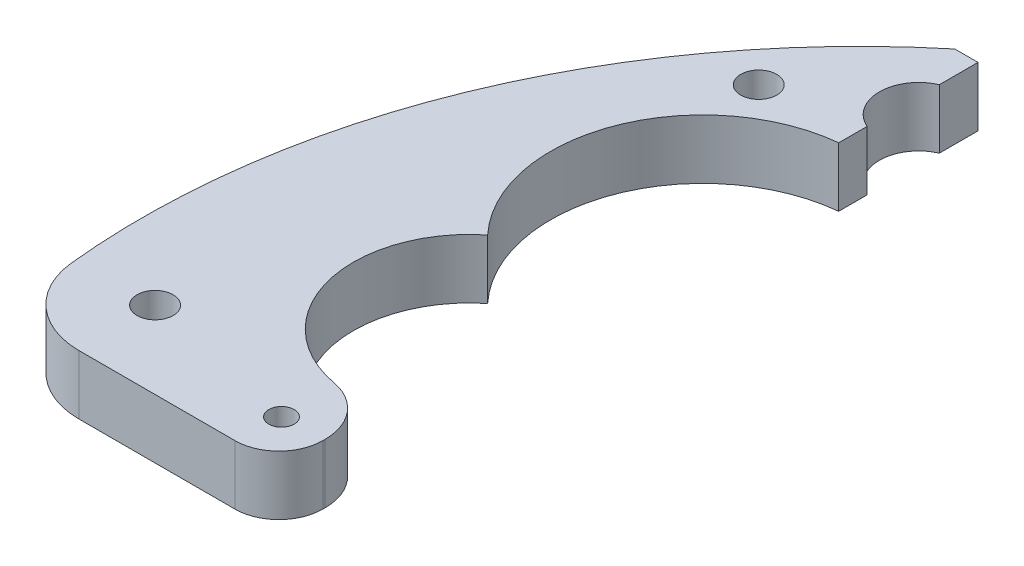
ISO-10303-21;
HEADER;
FILE_DESCRIPTION(('STEP AP214'),'2;1');
FILE_NAME('part.step','',(''),(''),'','','');
FILE_SCHEMA(('AUTOMOTIVE_DESIGN { 1 0 10303 214 1 1 1 1 }'));
ENDSEC;
DATA;
#1=APPLICATION_CONTEXT('core data for automotive mechanical design processes');
#2=APPLICATION_PROTOCOL_DEFINITION('international standard','automotive_design',2000,#1);
#3=PRODUCT_CONTEXT('',#1,'mechanical');
#4=PRODUCT('Part','Part','',(#3));
#5=PRODUCT_RELATED_PRODUCT_CATEGORY('part','',(#4));
#6=PRODUCT_DEFINITION_FORMATION('','',#4);
#7=PRODUCT_DEFINITION_CONTEXT('part definition',#1,'design');
#8=PRODUCT_DEFINITION('design','',#6,#7);
#9=PRODUCT_DEFINITION_SHAPE('','',#8);
#10=(LENGTH_UNIT() NAMED_UNIT(*) SI_UNIT(.MILLI.,.METRE.));
#11=(NAMED_UNIT(*) PLANE_ANGLE_UNIT() SI_UNIT($,.RADIAN.));
#12=(NAMED_UNIT(*) SI_UNIT($,.STERADIAN.) SOLID_ANGLE_UNIT());
#13=UNCERTAINTY_MEASURE_WITH_UNIT(LENGTH_MEASURE(1.E-05),#10,'distance_accuracy_value','');
#14=(GEOMETRIC_REPRESENTATION_CONTEXT(3) GLOBAL_UNCERTAINTY_ASSIGNED_CONTEXT((#13)) GLOBAL_UNIT_ASSIGNED_CONTEXT((#10,
#11,#12)) REPRESENTATION_CONTEXT('',''));
#15=CARTESIAN_POINT('',(0.,0.,0.));
#16=DIRECTION('',(0.,0.,1.));
#17=DIRECTION('',(1.,0.,0.));
#18=AXIS2_PLACEMENT_3D('',#15,#16,#17);
#19=CARTESIAN_POINT('',(32.6658026038348,5.842,-69.4049991597628));
#20=DIRECTION('',(-1.,0.,0.));
#21=DIRECTION('',(0.,0.,1.));
#22=AXIS2_PLACEMENT_3D('',#19,#20,#21);
#23=PLANE('',#22);
#24=DIRECTION('',(0.,0.,-1.));
#25=VECTOR('',#24,1.);
#26=CARTESIAN_POINT('',(32.6658026038348,0.,-69.4049991597628));
#27=LINE('',#26,#25);
#28=CARTESIAN_POINT('',(32.6658026038348,0.,-4.88899915976282));
#29=VERTEX_POINT('',#28);
#30=CARTESIAN_POINT('',(32.6658026038348,0.,-5.12803301314726));
#31=VERTEX_POINT('',#30);
#32=EDGE_CURVE('E173',#29,#31,#27,.T.);
#33=ORIENTED_EDGE('',*,*,#32,.T.);
#34=DIRECTION('',(0.,1.,0.));
#35=VECTOR('',#34,1.);
#36=CARTESIAN_POINT('',(32.6658026038348,5.842,-5.12803301314726));
#37=LINE('',#36,#35);
#38=CARTESIAN_POINT('',(32.6658026038348,5.842,-5.12803301314726));
#39=VERTEX_POINT('',#38);
#40=EDGE_CURVE('E202',#31,#39,#37,.T.);
#41=ORIENTED_EDGE('',*,*,#40,.T.);
#42=DIRECTION('',(0.,0.,-1.));
#43=VECTOR('',#42,1.);
#44=CARTESIAN_POINT('',(32.6658026038348,5.842,-69.4049991597628));
#45=LINE('',#44,#43);
#46=CARTESIAN_POINT('',(32.6658026038348,5.842,-4.88899915976282));
#47=VERTEX_POINT('',#46);
#48=EDGE_CURVE('E161',#47,#39,#45,.T.);
#49=ORIENTED_EDGE('',*,*,#48,.F.);
#50=DIRECTION('',(0.,-1.,0.));
#51=VECTOR('',#50,1.);
#52=CARTESIAN_POINT('',(32.6658026038348,5.842,-4.88899915976282));
#53=LINE('',#52,#51);
#54=EDGE_CURVE('E193',#47,#29,#53,.T.);
#55=ORIENTED_EDGE('',*,*,#54,.T.);
#56=EDGE_LOOP('',(#33,#41,#49,#55));
#57=FACE_BOUND('',#56,.T.);
#58=ADVANCED_FACE('F33',(#57),#23,.F.);
#59=CARTESIAN_POINT('',(32.6658026038348,5.842,-55.6889991597628));
#60=VERTEX_POINT('',#59);
#61=CARTESIAN_POINT('',(32.6658026038348,5.842,-58.4829991597628));
#62=VERTEX_POINT('',#61);
#63=EDGE_CURVE('E164',#60,#62,#45,.T.);
#64=ORIENTED_EDGE('',*,*,#63,.F.);
#65=DIRECTION('',(0.,1.,0.));
#66=VECTOR('',#65,1.);
#67=CARTESIAN_POINT('',(32.6658026038348,0.,-55.6889991597628));
#68=LINE('',#67,#66);
#69=CARTESIAN_POINT('',(32.6658026038348,0.,-55.6889991597628));
#70=VERTEX_POINT('',#69);
#71=EDGE_CURVE('E137',#70,#60,#68,.T.);
#72=ORIENTED_EDGE('',*,*,#71,.F.);
#73=CARTESIAN_POINT('',(32.6658026038348,0.,-58.4829991597628));
#74=VERTEX_POINT('',#73);
#75=EDGE_CURVE('E177',#70,#74,#27,.T.);
#76=ORIENTED_EDGE('',*,*,#75,.T.);
#77=DIRECTION('',(0.,1.,0.));
#78=VECTOR('',#77,1.);
#79=CARTESIAN_POINT('',(32.6658026038348,0.,-58.4829991597628));
#80=LINE('',#79,#78);
#81=EDGE_CURVE('E148',#74,#62,#80,.T.);
#82=ORIENTED_EDGE('',*,*,#81,.T.);
#83=EDGE_LOOP('',(#64,#72,#76,#82));
#84=FACE_BOUND('',#83,.T.);
#85=ADVANCED_FACE('F231',(#84),#23,.F.);
#86=CARTESIAN_POINT('',(32.6658026038348,5.842,-0.570999159762817));
#87=DIRECTION('',(0.,0.,-1.));
#88=DIRECTION('',(-1.,0.,0.));
#89=AXIS2_PLACEMENT_3D('',#86,#87,#88);
#90=PLANE('',#89);
#91=DIRECTION('',(1.,0.,0.));
#92=VECTOR('',#91,1.);
#93=CARTESIAN_POINT('',(32.6658026038348,0.,-0.570999159762817));
#94=LINE('',#93,#92);
#95=CARTESIAN_POINT('',(12.9787536595602,0.,-0.570999159762814));
#96=VERTEX_POINT('',#95);
#97=CARTESIAN_POINT('',(28.3478026038348,0.,-0.570999159762816));
#98=VERTEX_POINT('',#97);
#99=EDGE_CURVE('E153',#96,#98,#94,.T.);
#100=ORIENTED_EDGE('',*,*,#99,.T.);
#101=DIRECTION('',(0.,-1.,0.));
#102=VECTOR('',#101,1.);
#103=CARTESIAN_POINT('',(28.3478026038348,5.842,-0.570999159762816));
#104=LINE('',#103,#102);
#105=CARTESIAN_POINT('',(28.3478026038348,5.842,-0.570999159762816));
#106=VERTEX_POINT('',#105);
#107=EDGE_CURVE('E198',#98,#106,#104,.F.);
#108=ORIENTED_EDGE('',*,*,#107,.T.);
#109=DIRECTION('',(1.,0.,0.));
#110=VECTOR('',#109,1.);
#111=CARTESIAN_POINT('',(32.6658026038348,5.842,-0.570999159762817));
#112=LINE('',#111,#110);
#113=CARTESIAN_POINT('',(12.9787536595602,5.842,-0.570999159762814));
#114=VERTEX_POINT('',#113);
#115=EDGE_CURVE('E156',#114,#106,#112,.T.);
#116=ORIENTED_EDGE('',*,*,#115,.F.);
#117=DIRECTION('',(0.,-1.,0.));
#118=VECTOR('',#117,1.);
#119=CARTESIAN_POINT('',(12.9787536595602,5.842,-0.570999159762814));
#120=LINE('',#119,#118);
#121=EDGE_CURVE('E126',#114,#96,#120,.T.);
#122=ORIENTED_EDGE('',*,*,#121,.T.);
#123=EDGE_LOOP('',(#100,#108,#116,#122));
#124=FACE_BOUND('',#123,.T.);
#125=ADVANCED_FACE('F237',(#124),#90,.F.);
#126=CARTESIAN_POINT('',(32.6658026038348,5.842,-65.5949991597628));
#127=VERTEX_POINT('',#126);
#128=CARTESIAN_POINT('',(32.6658026038348,5.842,-69.4049991597628));
#129=VERTEX_POINT('',#128);
#130=EDGE_CURVE('E159',#127,#129,#45,.T.);
#131=ORIENTED_EDGE('',*,*,#130,.F.);
#132=DIRECTION('',(0.,1.,0.));
#133=VECTOR('',#132,1.);
#134=CARTESIAN_POINT('',(32.6658026038348,0.,-65.5949991597628));
#135=LINE('',#134,#133);
#136=CARTESIAN_POINT('',(32.6658026038348,0.,-65.5949991597628));
#137=VERTEX_POINT('',#136);
#138=EDGE_CURVE('E151',#137,#127,#135,.T.);
#139=ORIENTED_EDGE('',*,*,#138,.F.);
#140=CARTESIAN_POINT('',(32.6658026038348,0.,-69.4049991597628));
#141=VERTEX_POINT('',#140);
#142=EDGE_CURVE('E172',#137,#141,#27,.T.);
#143=ORIENTED_EDGE('',*,*,#142,.T.);
#144=DIRECTION('',(0.,-1.,0.));
#145=VECTOR('',#144,1.);
#146=CARTESIAN_POINT('',(32.6658026038348,5.842,-69.4049991597628));
#147=LINE('',#146,#145);
#148=EDGE_CURVE('E127',#129,#141,#147,.T.);
#149=ORIENTED_EDGE('',*,*,#148,.F.);
#150=EDGE_LOOP('',(#131,#139,#143,#149));
#151=FACE_BOUND('',#150,.T.);
#152=ADVANCED_FACE('F233',(#151),#23,.F.);
#153=CARTESIAN_POINT('',(30.3798026038348,5.842,-69.4049991597628));
#154=DIRECTION('',(0.,0.,1.));
#155=DIRECTION('',(1.,0.,0.));
#156=AXIS2_PLACEMENT_3D('',#153,#154,#155);
#157=PLANE('',#156);
#158=DIRECTION('',(-1.,0.,0.));
#159=VECTOR('',#158,1.);
#160=CARTESIAN_POINT('',(30.3798026038348,0.,-69.4049991597628));
#161=LINE('',#160,#159);
#162=CARTESIAN_POINT('',(30.3798026038348,0.,-69.4049991597628));
#163=VERTEX_POINT('',#162);
#164=EDGE_CURVE('E176',#141,#163,#161,.T.);
#165=ORIENTED_EDGE('',*,*,#164,.T.);
#166=DIRECTION('',(0.,-1.,0.));
#167=VECTOR('',#166,1.);
#168=CARTESIAN_POINT('',(30.3798026038348,5.842,-69.4049991597628));
#169=LINE('',#168,#167);
#170=CARTESIAN_POINT('',(30.3798026038348,5.842,-69.4049991597628));
#171=VERTEX_POINT('',#170);
#172=EDGE_CURVE('E169',#171,#163,#169,.T.);
#173=ORIENTED_EDGE('',*,*,#172,.F.);
#174=DIRECTION('',(-1.,0.,0.));
#175=VECTOR('',#174,1.);
#176=CARTESIAN_POINT('',(30.3798026038348,5.842,-69.4049991597628));
#177=LINE('',#176,#175);
#178=EDGE_CURVE('E163',#129,#171,#177,.T.);
#179=ORIENTED_EDGE('',*,*,#178,.F.);
#180=ORIENTED_EDGE('',*,*,#148,.T.);
#181=EDGE_LOOP('',(#165,#173,#179,#180));
#182=FACE_BOUND('',#181,.T.);
#183=ADVANCED_FACE('F242',(#182),#157,.F.);
#184=CARTESIAN_POINT('',(75.3749079719163,5.842,-14.9853791967822));
#185=DIRECTION('',(0.,-1.,0.));
#186=DIRECTION('',(0.,0.,-1.));
#187=AXIS2_PLACEMENT_3D('',#184,#185,#186);
#188=CYLINDRICAL_SURFACE('',#187,70.612);
#189=CARTESIAN_POINT('',(75.3749079719163,0.,-14.9853791967822));
#190=DIRECTION('',(0.,1.,0.));
#191=DIRECTION('',(0.,0.,-1.));
#192=AXIS2_PLACEMENT_3D('',#189,#190,#191);
#193=CIRCLE('',#192,70.612);
#194=CARTESIAN_POINT('',(5.14765736934546,0.,-7.62414174620977));
#195=VERTEX_POINT('',#194);
#196=EDGE_CURVE('E160',#163,#195,#193,.T.);
#197=ORIENTED_EDGE('',*,*,#196,.T.);
#198=DIRECTION('',(0.,-1.,0.));
#199=VECTOR('',#198,1.);
#200=CARTESIAN_POINT('',(5.14765736934546,5.842,-7.62414174620977));
#201=LINE('',#200,#199);
#202=CARTESIAN_POINT('',(5.14765736934546,5.842,-7.62414174620977));
#203=VERTEX_POINT('',#202);
#204=EDGE_CURVE('E189',#195,#203,#201,.F.);
#205=ORIENTED_EDGE('',*,*,#204,.T.);
#206=CARTESIAN_POINT('',(75.3749079719163,5.842,-14.9853791967822));
#207=DIRECTION('',(0.,1.,0.));
#208=DIRECTION('',(0.,0.,-1.));
#209=AXIS2_PLACEMENT_3D('',#206,#207,#208);
#210=CIRCLE('',#209,70.612);
#211=EDGE_CURVE('E166',#171,#203,#210,.T.);
#212=ORIENTED_EDGE('',*,*,#211,.F.);
#213=ORIENTED_EDGE('',*,*,#172,.T.);
#214=EDGE_LOOP('',(#197,#205,#212,#213));
#215=FACE_BOUND('',#214,.T.);
#216=ADVANCED_FACE('F248',(#215),#188,.T.);
#217=CARTESIAN_POINT('',(75.3749079719163,5.842,-14.9853791967822));
#218=DIRECTION('',(0.,-1.,0.));
#219=DIRECTION('',(0.,0.,-1.));
#220=AXIS2_PLACEMENT_3D('',#217,#218,#219);
#221=PLANE('',#220);
#222=CARTESIAN_POINT('',(12.8538026038348,5.842,-8.19099915976281));
#223=DIRECTION('',(0.,1.,0.));
#224=DIRECTION('',(0.,0.,1.));
#225=AXIS2_PLACEMENT_3D('',#222,#223,#224);
#226=CIRCLE('',#225,1.778);
#227=CARTESIAN_POINT('',(12.8538026038348,5.842,-6.41299915976281));
#228=VERTEX_POINT('',#227);
#229=EDGE_CURVE('E378',#228,#228,#226,.T.);
#230=ORIENTED_EDGE('',*,*,#229,.F.);
#231=EDGE_LOOP('',(#230));
#232=FACE_BOUND('',#231,.T.);
#233=CARTESIAN_POINT('',(28.6018026038348,5.842,-4.88899915976282));
#234=DIRECTION('',(0.,1.,0.));
#235=DIRECTION('',(0.,0.,1.));
#236=AXIS2_PLACEMENT_3D('',#233,#234,#235);
#237=CIRCLE('',#236,1.25);
#238=CARTESIAN_POINT('',(28.6018026038348,5.842,-3.63899915976281));
#239=VERTEX_POINT('',#238);
#240=EDGE_CURVE('E380',#239,#239,#237,.T.);
#241=ORIENTED_EDGE('',*,*,#240,.F.);
#242=EDGE_LOOP('',(#241));
#243=FACE_BOUND('',#242,.T.);
#244=CARTESIAN_POINT('',(23.7758026038348,5.842,-56.7049991597628));
#245=DIRECTION('',(0.,1.,0.));
#246=DIRECTION('',(0.,0.,1.));
#247=AXIS2_PLACEMENT_3D('',#244,#245,#246);
#248=CIRCLE('',#247,1.77480569885582);
#249=CARTESIAN_POINT('',(23.7758026038348,5.842,-54.930193460907));
#250=VERTEX_POINT('',#249);
#251=EDGE_CURVE('E386',#250,#250,#248,.T.);
#252=ORIENTED_EDGE('',*,*,#251,.F.);
#253=EDGE_LOOP('',(#252));
#254=FACE_BOUND('',#253,.T.);
#255=ORIENTED_EDGE('',*,*,#48,.T.);
#256=CARTESIAN_POINT('',(27.3318026038348,5.842,-5.12803301314727));
#257=DIRECTION('',(0.,-1.,0.));
#258=DIRECTION('',(0.,0.,-1.));
#259=AXIS2_PLACEMENT_3D('',#256,#257,#258);
#260=CIRCLE('',#259,5.334);
#261=CARTESIAN_POINT('',(28.3016207856529,5.842,-10.3731267867813));
#262=VERTEX_POINT('',#261);
#263=EDGE_CURVE('E55',#39,#262,#260,.F.);
#264=ORIENTED_EDGE('',*,*,#263,.T.);
#265=CARTESIAN_POINT('',(30.3798026038348,5.842,-21.6126134445686));
#266=DIRECTION('',(0.,1.,0.));
#267=DIRECTION('',(0.,0.,1.));
#268=AXIS2_PLACEMENT_3D('',#265,#266,#267);
#269=CIRCLE('',#268,11.43);
#270=CARTESIAN_POINT('',(23.2458618290697,5.842,-30.5429991597628));
#271=VERTEX_POINT('',#270);
#272=EDGE_CURVE('E121',#271,#262,#269,.T.);
#273=ORIENTED_EDGE('',*,*,#272,.F.);
#274=CARTESIAN_POINT('',(34.1898026038348,5.842,-40.7806920794804));
#275=DIRECTION('',(0.,1.,0.));
#276=DIRECTION('',(0.,0.,1.));
#277=AXIS2_PLACEMENT_3D('',#274,#275,#276);
#278=CIRCLE('',#277,14.986);
#279=EDGE_CURVE('E131',#60,#271,#278,.T.);
#280=ORIENTED_EDGE('',*,*,#279,.F.);
#281=ORIENTED_EDGE('',*,*,#63,.T.);
#282=CARTESIAN_POINT('',(34.1898026038348,5.842,-62.0389991597628));
#283=DIRECTION('',(0.,1.,0.));
#284=DIRECTION('',(0.,0.,-1.));
#285=AXIS2_PLACEMENT_3D('',#282,#283,#284);
#286=CIRCLE('',#285,3.86881273777886);
#287=EDGE_CURVE('E144',#127,#62,#286,.T.);
#288=ORIENTED_EDGE('',*,*,#287,.F.);
#289=ORIENTED_EDGE('',*,*,#130,.T.);
#290=ORIENTED_EDGE('',*,*,#178,.T.);
#291=ORIENTED_EDGE('',*,*,#211,.T.);
#292=CARTESIAN_POINT('',(12.9787536595602,5.842,-8.44499915976281));
#293=DIRECTION('',(0.,-1.,0.));
#294=DIRECTION('',(0.,0.,-1.));
#295=AXIS2_PLACEMENT_3D('',#292,#293,#294);
#296=CIRCLE('',#295,7.874);
#297=EDGE_CURVE('E191',#203,#114,#296,.F.);
#298=ORIENTED_EDGE('',*,*,#297,.T.);
#299=ORIENTED_EDGE('',*,*,#115,.T.);
#300=CARTESIAN_POINT('',(28.3478026038348,5.842,-4.88899915976282));
#301=DIRECTION('',(0.,-1.,0.));
#302=DIRECTION('',(0.,0.,-1.));
#303=AXIS2_PLACEMENT_3D('',#300,#301,#302);
#304=CIRCLE('',#303,4.318);
#305=EDGE_CURVE('E200',#106,#47,#304,.F.);
#306=ORIENTED_EDGE('',*,*,#305,.T.);
#307=EDGE_LOOP('',(#255,#264,#273,#280,#281,#288,#289,#290,#291,#298,#299,#306));
#308=FACE_BOUND('',#307,.T.);
#309=ADVANCED_FACE('F130',(#232,#243,#254,#308),#221,.F.);
#310=CARTESIAN_POINT('',(75.3749079719163,0.,-14.9853791967822));
#311=DIRECTION('',(0.,-1.,0.));
#312=DIRECTION('',(0.,0.,-1.));
#313=AXIS2_PLACEMENT_3D('',#310,#311,#312);
#314=PLANE('',#313);
#315=CARTESIAN_POINT('',(12.8538026038348,0.,-8.19099915976281));
#316=DIRECTION('',(0.,1.,0.));
#317=DIRECTION('',(0.,0.,1.));
#318=AXIS2_PLACEMENT_3D('',#315,#316,#317);
#319=CIRCLE('',#318,1.778);
#320=CARTESIAN_POINT('',(12.8538026038348,0.,-6.41299915976281));
#321=VERTEX_POINT('',#320);
#322=EDGE_CURVE('E375',#321,#321,#319,.T.);
#323=ORIENTED_EDGE('',*,*,#322,.T.);
#324=EDGE_LOOP('',(#323));
#325=FACE_BOUND('',#324,.T.);
#326=CARTESIAN_POINT('',(28.6018026038348,0.,-4.88899915976282));
#327=DIRECTION('',(0.,1.,0.));
#328=DIRECTION('',(0.,0.,1.));
#329=AXIS2_PLACEMENT_3D('',#326,#327,#328);
#330=CIRCLE('',#329,1.25);
#331=CARTESIAN_POINT('',(28.6018026038348,0.,-3.63899915976281));
#332=VERTEX_POINT('',#331);
#333=EDGE_CURVE('E383',#332,#332,#330,.T.);
#334=ORIENTED_EDGE('',*,*,#333,.T.);
#335=EDGE_LOOP('',(#334));
#336=FACE_BOUND('',#335,.T.);
#337=CARTESIAN_POINT('',(23.7758026038348,0.,-56.7049991597628));
#338=DIRECTION('',(0.,1.,0.));
#339=DIRECTION('',(0.,0.,1.));
#340=AXIS2_PLACEMENT_3D('',#337,#338,#339);
#341=CIRCLE('',#340,1.77480569885582);
#342=CARTESIAN_POINT('',(23.7758026038348,0.,-54.930193460907));
#343=VERTEX_POINT('',#342);
#344=EDGE_CURVE('E133',#343,#343,#341,.T.);
#345=ORIENTED_EDGE('',*,*,#344,.T.);
#346=EDGE_LOOP('',(#345));
#347=FACE_BOUND('',#346,.T.);
#348=CARTESIAN_POINT('',(30.3798026038348,0.,-21.6126134445686));
#349=DIRECTION('',(0.,1.,0.));
#350=DIRECTION('',(0.,0.,1.));
#351=AXIS2_PLACEMENT_3D('',#348,#349,#350);
#352=CIRCLE('',#351,11.43);
#353=CARTESIAN_POINT('',(23.2458618290697,0.,-30.5429991597628));
#354=VERTEX_POINT('',#353);
#355=CARTESIAN_POINT('',(28.3016207856529,0.,-10.3731267867813));
#356=VERTEX_POINT('',#355);
#357=EDGE_CURVE('E122',#354,#356,#352,.T.);
#358=ORIENTED_EDGE('',*,*,#357,.T.);
#359=CARTESIAN_POINT('',(27.3318026038348,0.,-5.12803301314727));
#360=DIRECTION('',(0.,-1.,0.));
#361=DIRECTION('',(0.,0.,-1.));
#362=AXIS2_PLACEMENT_3D('',#359,#360,#361);
#363=CIRCLE('',#362,5.334);
#364=EDGE_CURVE('E11',#356,#31,#363,.T.);
#365=ORIENTED_EDGE('',*,*,#364,.T.);
#366=ORIENTED_EDGE('',*,*,#32,.F.);
#367=CARTESIAN_POINT('',(28.3478026038348,0.,-4.88899915976282));
#368=DIRECTION('',(0.,-1.,0.));
#369=DIRECTION('',(0.,0.,-1.));
#370=AXIS2_PLACEMENT_3D('',#367,#368,#369);
#371=CIRCLE('',#370,4.318);
#372=EDGE_CURVE('E196',#29,#98,#371,.T.);
#373=ORIENTED_EDGE('',*,*,#372,.T.);
#374=ORIENTED_EDGE('',*,*,#99,.F.);
#375=CARTESIAN_POINT('',(12.9787536595602,0.,-8.44499915976281));
#376=DIRECTION('',(0.,-1.,0.));
#377=DIRECTION('',(0.,0.,-1.));
#378=AXIS2_PLACEMENT_3D('',#375,#376,#377);
#379=CIRCLE('',#378,7.874);
#380=EDGE_CURVE('E187',#96,#195,#379,.T.);
#381=ORIENTED_EDGE('',*,*,#380,.T.);
#382=ORIENTED_EDGE('',*,*,#196,.F.);
#383=ORIENTED_EDGE('',*,*,#164,.F.);
#384=ORIENTED_EDGE('',*,*,#142,.F.);
#385=CARTESIAN_POINT('',(34.1898026038348,0.,-62.0389991597628));
#386=DIRECTION('',(0.,1.,0.));
#387=DIRECTION('',(0.,0.,-1.));
#388=AXIS2_PLACEMENT_3D('',#385,#386,#387);
#389=CIRCLE('',#388,3.86881273777886);
#390=EDGE_CURVE('E145',#137,#74,#389,.T.);
#391=ORIENTED_EDGE('',*,*,#390,.T.);
#392=ORIENTED_EDGE('',*,*,#75,.F.);
#393=CARTESIAN_POINT('',(34.1898026038348,0.,-40.7806920794804));
#394=DIRECTION('',(0.,1.,0.));
#395=DIRECTION('',(0.,0.,1.));
#396=AXIS2_PLACEMENT_3D('',#393,#394,#395);
#397=CIRCLE('',#396,14.986);
#398=EDGE_CURVE('E138',#70,#354,#397,.T.);
#399=ORIENTED_EDGE('',*,*,#398,.T.);
#400=EDGE_LOOP('',(#358,#365,#366,#373,#374,#381,#382,#383,#384,#391,#392,#399));
#401=FACE_BOUND('',#400,.T.);
#402=ADVANCED_FACE('F218',(#325,#336,#347,#401),#314,.T.);
#403=CARTESIAN_POINT('',(34.1898026038348,0.,-62.0389991597628));
#404=DIRECTION('',(0.,1.,0.));
#405=DIRECTION('',(0.,0.,1.));
#406=AXIS2_PLACEMENT_3D('',#403,#404,#405);
#407=CYLINDRICAL_SURFACE('',#406,3.86881273777886);
#408=ORIENTED_EDGE('',*,*,#287,.T.);
#409=ORIENTED_EDGE('',*,*,#81,.F.);
#410=ORIENTED_EDGE('',*,*,#390,.F.);
#411=ORIENTED_EDGE('',*,*,#138,.T.);
#412=EDGE_LOOP('',(#408,#409,#410,#411));
#413=FACE_BOUND('',#412,.T.);
#414=ADVANCED_FACE('F259',(#413),#407,.F.);
#415=CARTESIAN_POINT('',(34.1898026038348,0.,-40.7806920794804));
#416=DIRECTION('',(0.,1.,0.));
#417=DIRECTION('',(0.,0.,1.));
#418=AXIS2_PLACEMENT_3D('',#415,#416,#417);
#419=CYLINDRICAL_SURFACE('',#418,14.986);
#420=ORIENTED_EDGE('',*,*,#279,.T.);
#421=DIRECTION('',(0.,1.,0.));
#422=VECTOR('',#421,1.);
#423=CARTESIAN_POINT('',(23.2458618290697,2.921,-30.5429991597628));
#424=LINE('',#423,#422);
#425=EDGE_CURVE('E119',#271,#354,#424,.F.);
#426=ORIENTED_EDGE('',*,*,#425,.T.);
#427=ORIENTED_EDGE('',*,*,#398,.F.);
#428=ORIENTED_EDGE('',*,*,#71,.T.);
#429=EDGE_LOOP('',(#420,#426,#427,#428));
#430=FACE_BOUND('',#429,.T.);
#431=ADVANCED_FACE('F135',(#430),#419,.F.);
#432=CARTESIAN_POINT('',(30.3798026038348,0.,-21.6126134445686));
#433=DIRECTION('',(0.,1.,0.));
#434=DIRECTION('',(0.,0.,1.));
#435=AXIS2_PLACEMENT_3D('',#432,#433,#434);
#436=CYLINDRICAL_SURFACE('',#435,11.43);
#437=ORIENTED_EDGE('',*,*,#272,.T.);
#438=DIRECTION('',(0.,1.,0.));
#439=VECTOR('',#438,1.);
#440=CARTESIAN_POINT('',(28.3016207856529,0.,-10.3731267867813));
#441=LINE('',#440,#439);
#442=EDGE_CURVE('E41',#262,#356,#441,.F.);
#443=ORIENTED_EDGE('',*,*,#442,.T.);
#444=ORIENTED_EDGE('',*,*,#357,.F.);
#445=ORIENTED_EDGE('',*,*,#425,.F.);
#446=EDGE_LOOP('',(#437,#443,#444,#445));
#447=FACE_BOUND('',#446,.T.);
#448=ADVANCED_FACE('F120',(#447),#436,.F.);
#449=CARTESIAN_POINT('',(12.9787536595602,5.842,-8.44499915976281));
#450=DIRECTION('',(0.,-1.,0.));
#451=DIRECTION('',(0.,0.,-1.));
#452=AXIS2_PLACEMENT_3D('',#449,#450,#451);
#453=CYLINDRICAL_SURFACE('',#452,7.874);
#454=ORIENTED_EDGE('',*,*,#297,.F.);
#455=ORIENTED_EDGE('',*,*,#204,.F.);
#456=ORIENTED_EDGE('',*,*,#380,.F.);
#457=ORIENTED_EDGE('',*,*,#121,.F.);
#458=EDGE_LOOP('',(#454,#455,#456,#457));
#459=FACE_BOUND('',#458,.T.);
#460=ADVANCED_FACE('F229',(#459),#453,.T.);
#461=CARTESIAN_POINT('',(28.3478026038348,5.842,-4.88899915976282));
#462=DIRECTION('',(0.,-1.,0.));
#463=DIRECTION('',(0.,0.,-1.));
#464=AXIS2_PLACEMENT_3D('',#461,#462,#463);
#465=CYLINDRICAL_SURFACE('',#464,4.318);
#466=ORIENTED_EDGE('',*,*,#305,.F.);
#467=ORIENTED_EDGE('',*,*,#107,.F.);
#468=ORIENTED_EDGE('',*,*,#372,.F.);
#469=ORIENTED_EDGE('',*,*,#54,.F.);
#470=EDGE_LOOP('',(#466,#467,#468,#469));
#471=FACE_BOUND('',#470,.T.);
#472=ADVANCED_FACE('F216',(#471),#465,.T.);
#473=CARTESIAN_POINT('',(27.3318026038348,0.,-5.12803301314727));
#474=DIRECTION('',(0.,1.,0.));
#475=DIRECTION('',(0.,0.,1.));
#476=AXIS2_PLACEMENT_3D('',#473,#474,#475);
#477=CYLINDRICAL_SURFACE('',#476,5.334);
#478=ORIENTED_EDGE('',*,*,#364,.F.);
#479=ORIENTED_EDGE('',*,*,#442,.F.);
#480=ORIENTED_EDGE('',*,*,#263,.F.);
#481=ORIENTED_EDGE('',*,*,#40,.F.);
#482=EDGE_LOOP('',(#478,#479,#480,#481));
#483=FACE_BOUND('',#482,.T.);
#484=ADVANCED_FACE('F35',(#483),#477,.T.);
#485=CARTESIAN_POINT('',(23.7758026038348,0.,-56.7049991597628));
#486=DIRECTION('',(0.,1.,0.));
#487=DIRECTION('',(0.,0.,1.));
#488=AXIS2_PLACEMENT_3D('',#485,#486,#487);
#489=CYLINDRICAL_SURFACE('',#488,1.77480569885582);
#490=ORIENTED_EDGE('',*,*,#344,.F.);
#491=EDGE_LOOP('',(#490));
#492=FACE_BOUND('',#491,.T.);
#493=ORIENTED_EDGE('',*,*,#251,.T.);
#494=EDGE_LOOP('',(#493));
#495=FACE_BOUND('',#494,.T.);
#496=ADVANCED_FACE('F221',(#492,#495),#489,.F.);
#497=CARTESIAN_POINT('',(28.6018026038348,0.,-4.88899915976282));
#498=DIRECTION('',(0.,1.,0.));
#499=DIRECTION('',(0.,0.,1.));
#500=AXIS2_PLACEMENT_3D('',#497,#498,#499);
#501=CYLINDRICAL_SURFACE('',#500,1.25);
#502=ORIENTED_EDGE('',*,*,#333,.F.);
#503=EDGE_LOOP('',(#502));
#504=FACE_BOUND('',#503,.T.);
#505=ORIENTED_EDGE('',*,*,#240,.T.);
#506=EDGE_LOOP('',(#505));
#507=FACE_BOUND('',#506,.T.);
#508=ADVANCED_FACE('F226',(#504,#507),#501,.F.);
#509=CARTESIAN_POINT('',(12.8538026038348,0.,-8.19099915976281));
#510=DIRECTION('',(0.,1.,0.));
#511=DIRECTION('',(0.,0.,1.));
#512=AXIS2_PLACEMENT_3D('',#509,#510,#511);
#513=CYLINDRICAL_SURFACE('',#512,1.778);
#514=ORIENTED_EDGE('',*,*,#322,.F.);
#515=EDGE_LOOP('',(#514));
#516=FACE_BOUND('',#515,.T.);
#517=ORIENTED_EDGE('',*,*,#229,.T.);
#518=EDGE_LOOP('',(#517));
#519=FACE_BOUND('',#518,.T.);
#520=ADVANCED_FACE('F359',(#516,#519),#513,.F.);
#521=CLOSED_SHELL('',(#58,#85,#125,#152,#183,#216,#309,#402,#414,#431,#448,#460,#472,#484,#496,
#508,#520));
#522=MANIFOLD_SOLID_BREP('B2',#521);
#523=ADVANCED_BREP_SHAPE_REPRESENTATION('',(#18,#522),#14);
#524=SHAPE_DEFINITION_REPRESENTATION(#9,#523);
ENDSEC;
END-ISO-10303-21;
